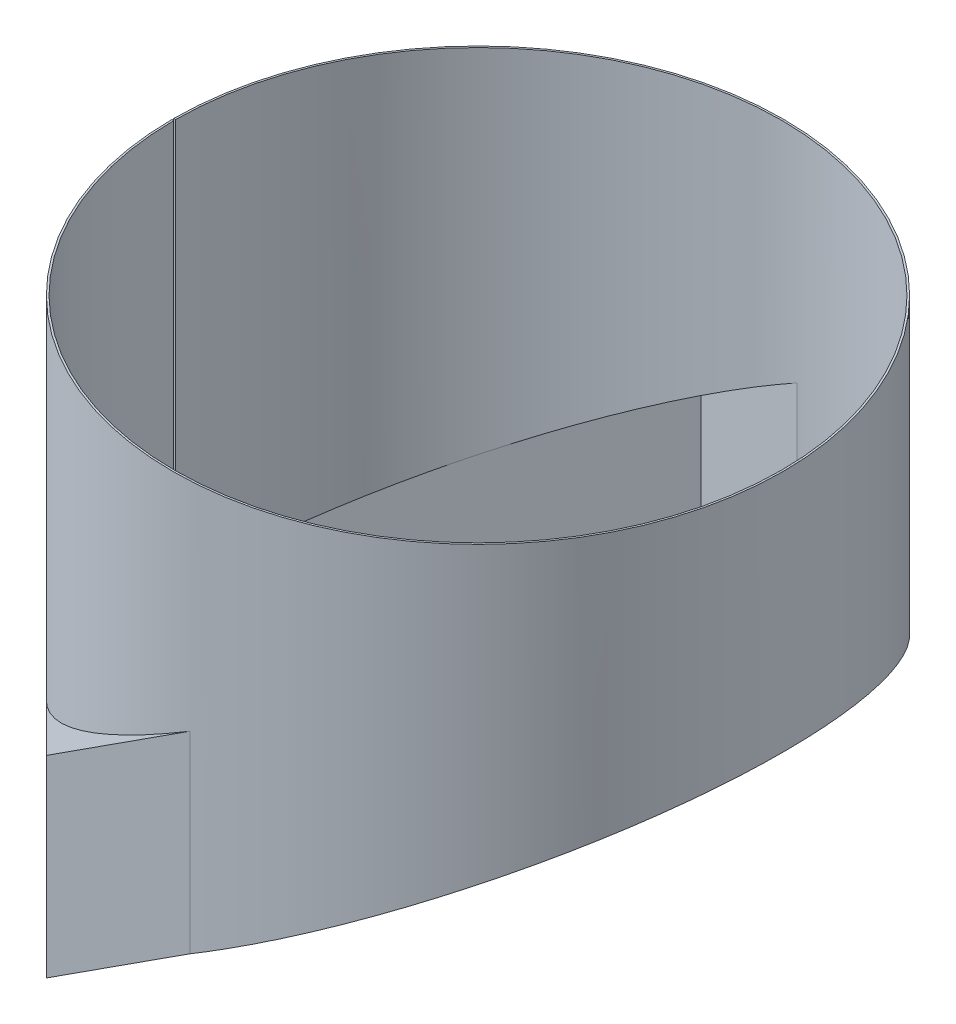
ISO-10303-21;
HEADER;
FILE_DESCRIPTION(('STEP AP214'),'2;1');
FILE_NAME('part.step','',(''),(''),'','','');
FILE_SCHEMA(('AUTOMOTIVE_DESIGN { 1 0 10303 214 1 1 1 1 }'));
ENDSEC;
DATA;
#1=APPLICATION_CONTEXT('core data for automotive mechanical design processes');
#2=APPLICATION_PROTOCOL_DEFINITION('international standard','automotive_design',2000,#1);
#3=PRODUCT_CONTEXT('',#1,'mechanical');
#4=PRODUCT('Part','Part','',(#3));
#5=PRODUCT_RELATED_PRODUCT_CATEGORY('part','',(#4));
#6=PRODUCT_DEFINITION_FORMATION('','',#4);
#7=PRODUCT_DEFINITION_CONTEXT('part definition',#1,'design');
#8=PRODUCT_DEFINITION('design','',#6,#7);
#9=PRODUCT_DEFINITION_SHAPE('','',#8);
#10=(LENGTH_UNIT() NAMED_UNIT(*) SI_UNIT(.MILLI.,.METRE.));
#11=(NAMED_UNIT(*) PLANE_ANGLE_UNIT() SI_UNIT($,.RADIAN.));
#12=(NAMED_UNIT(*) SI_UNIT($,.STERADIAN.) SOLID_ANGLE_UNIT());
#13=UNCERTAINTY_MEASURE_WITH_UNIT(LENGTH_MEASURE(1.E-05),#10,'distance_accuracy_value','');
#14=(GEOMETRIC_REPRESENTATION_CONTEXT(3) GLOBAL_UNCERTAINTY_ASSIGNED_CONTEXT((#13)) GLOBAL_UNIT_ASSIGNED_CONTEXT((#10,
#11,#12)) REPRESENTATION_CONTEXT('',''));
#15=CARTESIAN_POINT('',(0.,0.,0.));
#16=DIRECTION('',(0.,0.,1.));
#17=DIRECTION('',(1.,0.,0.));
#18=AXIS2_PLACEMENT_3D('',#15,#16,#17);
#19=CARTESIAN_POINT('',(230.261909045248,-363.20368421664,0.));
#20=DIRECTION('',(0.,1.,0.));
#21=DIRECTION('',(0.,0.,1.));
#22=AXIS2_PLACEMENT_3D('',#19,#20,#21);
#23=CYLINDRICAL_SURFACE('',#22,163.819757334855);
#24=CARTESIAN_POINT('',(230.261909045248,358.,0.));
#25=DIRECTION('',(0.,1.,0.));
#26=DIRECTION('',(0.,0.,1.));
#27=AXIS2_PLACEMENT_3D('',#24,#25,#26);
#28=CIRCLE('',#27,163.819757334855);
#29=CARTESIAN_POINT('',(66.4429147458969,358.,0.500000000000001));
#30=VERTEX_POINT('',#29);
#31=CARTESIAN_POINT('',(66.4429147458969,358.,-0.499999999999999));
#32=VERTEX_POINT('',#31);
#33=EDGE_CURVE('E199',#30,#32,#28,.T.);
#34=ORIENTED_EDGE('',*,*,#33,.F.);
#35=DIRECTION('',(0.,1.,0.));
#36=VECTOR('',#35,1.);
#37=CARTESIAN_POINT('',(66.4429147458969,-363.20368421664,0.500000000000001));
#38=LINE('',#37,#36);
#39=CARTESIAN_POINT('',(66.4429147458969,140.675901178656,0.500000000000001));
#40=VERTEX_POINT('',#39);
#41=EDGE_CURVE('E400',#30,#40,#38,.F.);
#42=ORIENTED_EDGE('',*,*,#41,.T.);
#43=CARTESIAN_POINT('',(230.261909045248,235.256841635759,0.));
#44=DIRECTION('',(0.499999999999995,-0.866025403784442,0.));
#45=DIRECTION('',(0.866025403784442,0.499999999999995,0.));
#46=AXIS2_PLACEMENT_3D('',#43,#44,#45);
#47=ELLIPSE('',#46,189.162761991714,163.819757334855);
#48=CARTESIAN_POINT('',(102.35129265954,161.407612833261,102.351292659541));
#49=VERTEX_POINT('',#48);
#50=EDGE_CURVE('E290',#40,#49,#47,.F.);
#51=ORIENTED_EDGE('',*,*,#50,.T.);
#52=CARTESIAN_POINT('',(114.423847741437,168.3777057596,115.83806130381));
#53=VERTEX_POINT('',#52);
#54=EDGE_CURVE('E250',#49,#53,#47,.F.);
#55=ORIENTED_EDGE('',*,*,#54,.T.);
#56=DIRECTION('',(0.,1.,0.));
#57=VECTOR('',#56,1.);
#58=CARTESIAN_POINT('',(114.423847741436,168.95505602879,115.83806130381));
#59=LINE('',#58,#57);
#60=CARTESIAN_POINT('',(114.423847741436,169.532406297979,115.83806130381));
#61=VERTEX_POINT('',#60);
#62=EDGE_CURVE('E268',#61,#53,#59,.F.);
#63=ORIENTED_EDGE('',*,*,#62,.F.);
#64=CARTESIAN_POINT('',(230.261909045248,236.411542174138,0.));
#65=DIRECTION('',(0.499999999999995,-0.866025403784442,0.));
#66=DIRECTION('',(0.866025403784442,0.499999999999995,0.));
#67=AXIS2_PLACEMENT_3D('',#64,#65,#66);
#68=ELLIPSE('',#67,189.162761991714,163.819757334855);
#69=CARTESIAN_POINT('',(239.145793207002,241.540655086377,163.578695114771));
#70=VERTEX_POINT('',#69);
#71=EDGE_CURVE('E225',#61,#70,#68,.F.);
#72=ORIENTED_EDGE('',*,*,#71,.T.);
#73=DIRECTION('',(0.,1.,0.));
#74=VECTOR('',#73,1.);
#75=CARTESIAN_POINT('',(239.145793207002,241.540655086377,163.578695114771));
#76=LINE('',#75,#74);
#77=CARTESIAN_POINT('',(239.145793207002,138.070888083627,163.578695114771));
#78=VERTEX_POINT('',#77);
#79=EDGE_CURVE('E237',#70,#78,#76,.F.);
#80=ORIENTED_EDGE('',*,*,#79,.T.);
#81=CARTESIAN_POINT('',(230.261909045248,132.941775171389,0.));
#82=DIRECTION('',(0.499999999999995,-0.866025403784442,0.));
#83=DIRECTION('',(0.866025403784442,0.499999999999995,0.));
#84=AXIS2_PLACEMENT_3D('',#81,#82,#83);
#85=ELLIPSE('',#84,189.162761991714,163.819757334855);
#86=CARTESIAN_POINT('',(239.145793207002,138.070888083627,-163.578695114771));
#87=VERTEX_POINT('',#86);
#88=EDGE_CURVE('E247',#78,#87,#85,.F.);
#89=ORIENTED_EDGE('',*,*,#88,.T.);
#90=DIRECTION('',(0.,1.,0.));
#91=VECTOR('',#90,1.);
#92=CARTESIAN_POINT('',(239.145793207002,241.540655086376,-163.578695114771));
#93=LINE('',#92,#91);
#94=CARTESIAN_POINT('',(239.145793207002,241.540655086376,-163.578695114771));
#95=VERTEX_POINT('',#94);
#96=EDGE_CURVE('E240',#95,#87,#93,.F.);
#97=ORIENTED_EDGE('',*,*,#96,.F.);
#98=CARTESIAN_POINT('',(230.261909045248,236.411542174138,0.));
#99=DIRECTION('',(0.499999999999995,-0.866025403784442,0.));
#100=DIRECTION('',(0.866025403784442,0.499999999999995,0.));
#101=AXIS2_PLACEMENT_3D('',#98,#99,#100);
#102=ELLIPSE('',#101,189.162761991714,163.819757334855);
#103=CARTESIAN_POINT('',(114.423847741437,169.532406297979,-115.83806130381));
#104=VERTEX_POINT('',#103);
#105=EDGE_CURVE('E244',#95,#104,#102,.F.);
#106=ORIENTED_EDGE('',*,*,#105,.T.);
#107=DIRECTION('',(0.,1.,0.));
#108=VECTOR('',#107,1.);
#109=CARTESIAN_POINT('',(114.423847741436,168.95505602879,-115.83806130381));
#110=LINE('',#109,#108);
#111=CARTESIAN_POINT('',(114.423847741436,168.3777057596,-115.83806130381));
#112=VERTEX_POINT('',#111);
#113=EDGE_CURVE('E271',#104,#112,#110,.F.);
#114=ORIENTED_EDGE('',*,*,#113,.T.);
#115=CARTESIAN_POINT('',(102.35129265954,161.407612833261,-102.351292659541));
#116=VERTEX_POINT('',#115);
#117=EDGE_CURVE('E248',#112,#116,#47,.F.);
#118=ORIENTED_EDGE('',*,*,#117,.T.);
#119=CARTESIAN_POINT('',(66.4429147458969,140.675901178656,-0.499999999999999));
#120=VERTEX_POINT('',#119);
#121=EDGE_CURVE('E289',#116,#120,#47,.F.);
#122=ORIENTED_EDGE('',*,*,#121,.T.);
#123=DIRECTION('',(0.,1.,0.));
#124=VECTOR('',#123,1.);
#125=CARTESIAN_POINT('',(66.4429147458969,-363.20368421664,-0.499999999999999));
#126=LINE('',#125,#124);
#127=EDGE_CURVE('E52',#120,#32,#126,.T.);
#128=ORIENTED_EDGE('',*,*,#127,.T.);
#129=EDGE_LOOP('',(#34,#42,#51,#55,#63,#72,#80,#89,#97,#106,#114,#118,#122,#128));
#130=FACE_BOUND('',#129,.T.);
#131=ADVANCED_FACE('F37',(#130),#23,.T.);
#132=CARTESIAN_POINT('',(230.261909045248,358.,0.));
#133=DIRECTION('',(0.,1.,0.));
#134=DIRECTION('',(0.,0.,1.));
#135=AXIS2_PLACEMENT_3D('',#132,#133,#134);
#136=PLANE('',#135);
#137=CARTESIAN_POINT('',(230.261909045248,358.,0.));
#138=DIRECTION('',(0.,1.,0.));
#139=DIRECTION('',(0.,0.,1.));
#140=AXIS2_PLACEMENT_3D('',#137,#138,#139);
#141=CIRCLE('',#140,162.819757334855);
#142=CARTESIAN_POINT('',(67.4429194323005,358.,0.500000000000001));
#143=VERTEX_POINT('',#142);
#144=CARTESIAN_POINT('',(67.4429194323005,358.,-0.499999999999999));
#145=VERTEX_POINT('',#144);
#146=EDGE_CURVE('E197',#143,#145,#141,.T.);
#147=ORIENTED_EDGE('',*,*,#146,.F.);
#148=DIRECTION('',(1.,0.,0.));
#149=VECTOR('',#148,1.);
#150=CARTESIAN_POINT('',(151.507940961405,358.,0.499999999999985));
#151=LINE('',#150,#149);
#152=EDGE_CURVE('E200',#30,#143,#151,.T.);
#153=ORIENTED_EDGE('',*,*,#152,.F.);
#154=ORIENTED_EDGE('',*,*,#33,.T.);
#155=DIRECTION('',(-1.,0.,0.));
#156=VECTOR('',#155,1.);
#157=CARTESIAN_POINT('',(151.507940961405,358.,-0.500000000000015));
#158=LINE('',#157,#156);
#159=EDGE_CURVE('E186',#145,#32,#158,.T.);
#160=ORIENTED_EDGE('',*,*,#159,.F.);
#161=EDGE_LOOP('',(#147,#153,#154,#160));
#162=FACE_BOUND('',#161,.T.);
#163=ADVANCED_FACE('F195',(#162),#136,.T.);
#164=CARTESIAN_POINT('',(230.261909045248,-363.20368421664,0.));
#165=DIRECTION('',(0.,1.,0.));
#166=DIRECTION('',(0.,0.,1.));
#167=AXIS2_PLACEMENT_3D('',#164,#165,#166);
#168=CYLINDRICAL_SURFACE('',#167,162.819757334855);
#169=DIRECTION('',(0.,1.,0.));
#170=VECTOR('',#169,1.);
#171=CARTESIAN_POINT('',(67.4429194323005,-363.20368421664,0.5));
#172=LINE('',#171,#170);
#173=CARTESIAN_POINT('',(67.4429194323004,141.253254153542,0.500000000000001));
#174=VERTEX_POINT('',#173);
#175=EDGE_CURVE('E60',#143,#174,#172,.F.);
#176=ORIENTED_EDGE('',*,*,#175,.F.);
#177=ORIENTED_EDGE('',*,*,#146,.T.);
#178=DIRECTION('',(0.,1.,0.));
#179=VECTOR('',#178,1.);
#180=CARTESIAN_POINT('',(67.4429194323005,-363.20368421664,-0.499999999999999));
#181=LINE('',#180,#179);
#182=CARTESIAN_POINT('',(67.4429194323004,141.253254153542,-0.499999999999999));
#183=VERTEX_POINT('',#182);
#184=EDGE_CURVE('E183',#183,#145,#181,.T.);
#185=ORIENTED_EDGE('',*,*,#184,.F.);
#186=CARTESIAN_POINT('',(230.261909045248,235.256841635759,0.));
#187=DIRECTION('',(0.499999999999995,-0.866025403784442,0.));
#188=DIRECTION('',(0.866025403784442,0.499999999999995,0.));
#189=AXIS2_PLACEMENT_3D('',#186,#187,#188);
#190=ELLIPSE('',#189,188.008061453335,162.819757334855);
#191=CARTESIAN_POINT('',(115.130954522623,168.785954050064,-115.130954522623));
#192=VERTEX_POINT('',#191);
#193=EDGE_CURVE('E326',#192,#183,#190,.F.);
#194=ORIENTED_EDGE('',*,*,#193,.F.);
#195=CARTESIAN_POINT('',(239.023011444508,240.31506646437,-162.583875163962));
#196=VERTEX_POINT('',#195);
#197=EDGE_CURVE('E221',#196,#192,#190,.F.);
#198=ORIENTED_EDGE('',*,*,#197,.F.);
#199=DIRECTION('',(0.,-1.,0.));
#200=VECTOR('',#199,1.);
#201=CARTESIAN_POINT('',(239.023011444508,240.31506646437,-162.583875163962));
#202=LINE('',#201,#200);
#203=CARTESIAN_POINT('',(239.023011444508,138.,-162.583875163962));
#204=VERTEX_POINT('',#203);
#205=EDGE_CURVE('E313',#196,#204,#202,.T.);
#206=ORIENTED_EDGE('',*,*,#205,.T.);
#207=CARTESIAN_POINT('',(230.261909045248,132.941775171389,0.));
#208=DIRECTION('',(0.499999999999995,-0.866025403784442,0.));
#209=DIRECTION('',(0.866025403784442,0.499999999999995,0.));
#210=AXIS2_PLACEMENT_3D('',#207,#208,#209);
#211=ELLIPSE('',#210,188.008061453335,162.819757334855);
#212=CARTESIAN_POINT('',(239.023011444508,138.,162.583875163961));
#213=VERTEX_POINT('',#212);
#214=EDGE_CURVE('E217',#213,#204,#211,.F.);
#215=ORIENTED_EDGE('',*,*,#214,.F.);
#216=DIRECTION('',(0.,-1.,0.));
#217=VECTOR('',#216,1.);
#218=CARTESIAN_POINT('',(239.023011444508,240.31506646437,162.583875163961));
#219=LINE('',#218,#217);
#220=CARTESIAN_POINT('',(239.023011444508,240.31506646437,162.583875163961));
#221=VERTEX_POINT('',#220);
#222=EDGE_CURVE('E318',#221,#213,#219,.T.);
#223=ORIENTED_EDGE('',*,*,#222,.F.);
#224=CARTESIAN_POINT('',(115.130954522623,168.785954050064,115.130954522623));
#225=VERTEX_POINT('',#224);
#226=EDGE_CURVE('E322',#225,#221,#190,.F.);
#227=ORIENTED_EDGE('',*,*,#226,.F.);
#228=EDGE_CURVE('E325',#174,#225,#190,.F.);
#229=ORIENTED_EDGE('',*,*,#228,.F.);
#230=EDGE_LOOP('',(#176,#177,#185,#194,#198,#206,#215,#223,#227,#229));
#231=FACE_BOUND('',#230,.T.);
#232=ADVANCED_FACE('F202',(#231),#168,.F.);
#233=CARTESIAN_POINT('',(0.,102.31506646437,0.));
#234=DIRECTION('',(0.499999999999995,-0.866025403784442,0.));
#235=DIRECTION('',(0.866025403784442,0.499999999999995,0.));
#236=AXIS2_PLACEMENT_3D('',#233,#234,#235);
#237=PLANE('',#236);
#238=ORIENTED_EDGE('',*,*,#50,.F.);
#239=DIRECTION('',(0.866025403784442,0.499999999999995,0.));
#240=VECTOR('',#239,1.);
#241=CARTESIAN_POINT('',(0.,102.31506646437,0.500000000000013));
#242=LINE('',#241,#240);
#243=EDGE_CURVE('E12',#40,#174,#242,.T.);
#244=ORIENTED_EDGE('',*,*,#243,.T.);
#245=ORIENTED_EDGE('',*,*,#228,.T.);
#246=DIRECTION('',(-0.654653670707976,-0.377964473009221,-0.654653670707982));
#247=VECTOR('',#246,1.);
#248=CARTESIAN_POINT('',(175.,203.351363572553,175.000000000002));
#249=LINE('',#248,#247);
#250=EDGE_CURVE('E302',#225,#49,#249,.T.);
#251=ORIENTED_EDGE('',*,*,#250,.T.);
#252=EDGE_LOOP('',(#238,#244,#245,#251));
#253=FACE_BOUND('',#252,.T.);
#254=ADVANCED_FACE('F412',(#253),#237,.T.);
#255=ORIENTED_EDGE('',*,*,#193,.T.);
#256=DIRECTION('',(-0.866025403784442,-0.499999999999995,0.));
#257=VECTOR('',#256,1.);
#258=CARTESIAN_POINT('',(0.,102.31506646437,-0.499999999999987));
#259=LINE('',#258,#257);
#260=EDGE_CURVE('E45',#183,#120,#259,.T.);
#261=ORIENTED_EDGE('',*,*,#260,.T.);
#262=ORIENTED_EDGE('',*,*,#121,.F.);
#263=DIRECTION('',(0.654653670707975,0.377964473009221,-0.654653670707982));
#264=VECTOR('',#263,1.);
#265=CARTESIAN_POINT('',(8.48528137423848,107.214045949936,-8.48528137423866));
#266=LINE('',#265,#264);
#267=EDGE_CURVE('E393',#116,#192,#266,.T.);
#268=ORIENTED_EDGE('',*,*,#267,.T.);
#269=EDGE_LOOP('',(#255,#261,#262,#268));
#270=FACE_BOUND('',#269,.T.);
#271=ADVANCED_FACE('F503',(#270),#237,.T.);
#272=CARTESIAN_POINT('',(0.,138.,0.));
#273=DIRECTION('',(0.,1.,0.));
#274=DIRECTION('',(0.,0.,1.));
#275=AXIS2_PLACEMENT_3D('',#272,#273,#274);
#276=PLANE('',#275);
#277=DIRECTION('',(0.707106781186544,0.,0.707106781186551));
#278=VECTOR('',#277,1.);
#279=CARTESIAN_POINT('',(175.,138.,175.000000000002));
#280=LINE('',#279,#278);
#281=CARTESIAN_POINT('',(8.48528137423851,138.,8.48528137423862));
#282=VERTEX_POINT('',#281);
#283=CARTESIAN_POINT('',(61.8081179484305,138.,61.8081179484311));
#284=VERTEX_POINT('',#283);
#285=EDGE_CURVE('E215',#282,#284,#280,.T.);
#286=ORIENTED_EDGE('',*,*,#285,.F.);
#287=CARTESIAN_POINT('',(0.,138.,0.));
#288=DIRECTION('',(0.,-1.,0.));
#289=DIRECTION('',(0.,0.,1.));
#290=AXIS2_PLACEMENT_3D('',#287,#288,#289);
#291=CIRCLE('',#290,12.);
#292=CARTESIAN_POINT('',(7.74866048145727,138.,9.16287404383047));
#293=VERTEX_POINT('',#292);
#294=EDGE_CURVE('E236',#282,#293,#291,.T.);
#295=ORIENTED_EDGE('',*,*,#294,.T.);
#296=DIRECTION('',(0.707106781186544,0.,0.707106781186551));
#297=VECTOR('',#296,1.);
#298=CARTESIAN_POINT('',(174.292893218813,138.,175.707106781188));
#299=LINE('',#298,#297);
#300=CARTESIAN_POINT('',(61.8081179484305,138.,63.2223315108043));
#301=VERTEX_POINT('',#300);
#302=EDGE_CURVE('E235',#293,#301,#299,.T.);
#303=ORIENTED_EDGE('',*,*,#302,.T.);
#304=DIRECTION('',(0.,0.,-1.));
#305=VECTOR('',#304,1.);
#306=CARTESIAN_POINT('',(61.8081179484305,138.,0.));
#307=LINE('',#306,#305);
#308=EDGE_CURVE('E222',#301,#284,#307,.T.);
#309=ORIENTED_EDGE('',*,*,#308,.T.);
#310=EDGE_LOOP('',(#286,#295,#303,#309));
#311=FACE_BOUND('',#310,.T.);
#312=ADVANCED_FACE('F350',(#311),#276,.T.);
#313=CARTESIAN_POINT('',(0.,138.,0.));
#314=DIRECTION('',(0.,-1.,0.));
#315=DIRECTION('',(0.,0.,-1.));
#316=AXIS2_PLACEMENT_3D('',#313,#314,#315);
#317=CYLINDRICAL_SURFACE('',#316,12.);
#318=DIRECTION('',(0.,-1.,0.));
#319=VECTOR('',#318,1.);
#320=CARTESIAN_POINT('',(8.48528137423848,138.,-8.48528137423866));
#321=LINE('',#320,#319);
#322=CARTESIAN_POINT('',(8.48528137423848,138.,-8.48528137423866));
#323=VERTEX_POINT('',#322);
#324=CARTESIAN_POINT('',(8.48528137423848,4.89897948556622,-8.48528137423866));
#325=VERTEX_POINT('',#324);
#326=EDGE_CURVE('E332',#323,#325,#321,.T.);
#327=ORIENTED_EDGE('',*,*,#326,.F.);
#328=CARTESIAN_POINT('',(7.74866048145724,138.,-9.1628740438305));
#329=VERTEX_POINT('',#328);
#330=EDGE_CURVE('E232',#329,#323,#291,.T.);
#331=ORIENTED_EDGE('',*,*,#330,.F.);
#332=DIRECTION('',(0.,-1.,0.));
#333=VECTOR('',#332,1.);
#334=CARTESIAN_POINT('',(7.74866048145724,138.,-9.1628740438305));
#335=LINE('',#334,#333);
#336=CARTESIAN_POINT('',(7.74866048145724,4.47369121482829,-9.1628740438305));
#337=VERTEX_POINT('',#336);
#338=EDGE_CURVE('E265',#329,#337,#335,.T.);
#339=ORIENTED_EDGE('',*,*,#338,.T.);
#340=CARTESIAN_POINT('',(0.,0.,0.));
#341=DIRECTION('',(0.499999999999995,-0.866025403784442,0.));
#342=DIRECTION('',(-0.866025403784442,-0.499999999999995,0.));
#343=AXIS2_PLACEMENT_3D('',#340,#341,#342);
#344=ELLIPSE('',#343,13.856406460551,12.);
#345=EDGE_CURVE('E231',#325,#337,#344,.F.);
#346=ORIENTED_EDGE('',*,*,#345,.F.);
#347=EDGE_LOOP('',(#327,#331,#339,#346));
#348=FACE_BOUND('',#347,.T.);
#349=ADVANCED_FACE('F583',(#348),#317,.F.);
#350=CARTESIAN_POINT('',(0.,102.31506646437,0.));
#351=DIRECTION('',(0.499999999999995,-0.866025403784442,0.));
#352=DIRECTION('',(0.866025403784442,0.499999999999995,0.));
#353=AXIS2_PLACEMENT_3D('',#350,#351,#352);
#354=PLANE('',#353);
#355=CARTESIAN_POINT('',(61.8081179484305,138.,-61.8081179484313));
#356=VERTEX_POINT('',#355);
#357=CARTESIAN_POINT('',(61.8081179484305,138.,-63.2223315108044));
#358=VERTEX_POINT('',#357);
#359=EDGE_CURVE('E226',#356,#358,#307,.T.);
#360=ORIENTED_EDGE('',*,*,#359,.F.);
#361=EDGE_CURVE('E390',#356,#116,#266,.T.);
#362=ORIENTED_EDGE('',*,*,#361,.T.);
#363=ORIENTED_EDGE('',*,*,#117,.F.);
#364=DIRECTION('',(0.654653670707975,0.377964473009221,-0.654653670707983));
#365=VECTOR('',#364,1.);
#366=CARTESIAN_POINT('',(15.4967379295343,111.262112279548,-16.9109514919077));
#367=LINE('',#366,#365);
#368=EDGE_CURVE('E208',#358,#112,#367,.T.);
#369=ORIENTED_EDGE('',*,*,#368,.F.);
#370=EDGE_LOOP('',(#360,#362,#363,#369));
#371=FACE_BOUND('',#370,.T.);
#372=ADVANCED_FACE('F389',(#371),#354,.F.);
#373=DIRECTION('',(-0.707106781186544,0.,0.707106781186552));
#374=VECTOR('',#373,1.);
#375=CARTESIAN_POINT('',(8.48528137423848,138.,-8.48528137423866));
#376=LINE('',#375,#374);
#377=EDGE_CURVE('E220',#356,#323,#376,.T.);
#378=ORIENTED_EDGE('',*,*,#377,.F.);
#379=ORIENTED_EDGE('',*,*,#359,.T.);
#380=DIRECTION('',(-0.707106781186544,0.,0.707106781186551));
#381=VECTOR('',#380,1.);
#382=CARTESIAN_POINT('',(7.77817459305193,138.,-9.1923881554252));
#383=LINE('',#382,#381);
#384=EDGE_CURVE('E277',#358,#329,#383,.T.);
#385=ORIENTED_EDGE('',*,*,#384,.T.);
#386=ORIENTED_EDGE('',*,*,#330,.T.);
#387=EDGE_LOOP('',(#378,#379,#385,#386));
#388=FACE_BOUND('',#387,.T.);
#389=ADVANCED_FACE('F422',(#388),#276,.T.);
#390=CARTESIAN_POINT('',(239.023011444508,138.,-162.583875163962));
#391=DIRECTION('',(0.499999999999995,-0.866025403784442,0.));
#392=DIRECTION('',(0.866025403784442,0.499999999999995,0.));
#393=AXIS2_PLACEMENT_3D('',#390,#391,#392);
#394=PLANE('',#393);
#395=DIRECTION('',(-0.654653670707976,-0.377964473009221,-0.654653670707982));
#396=VECTOR('',#395,1.);
#397=CARTESIAN_POINT('',(184.146144492072,106.316826092728,184.146144492074));
#398=LINE('',#397,#396);
#399=CARTESIAN_POINT('',(175.,101.036297108183,175.000000000002));
#400=VERTEX_POINT('',#399);
#401=CARTESIAN_POINT('',(8.48528137423851,4.89897948556625,8.48528137423861));
#402=VERTEX_POINT('',#401);
#403=EDGE_CURVE('E211',#400,#402,#398,.T.);
#404=ORIENTED_EDGE('',*,*,#403,.F.);
#405=DIRECTION('',(-0.854063760775078,-0.493093942188589,0.165630482422911));
#406=VECTOR('',#405,1.);
#407=CARTESIAN_POINT('',(288.134041567968,166.354266461959,153.059663992359));
#408=LINE('',#407,#406);
#409=EDGE_CURVE('E205',#213,#400,#408,.T.);
#410=ORIENTED_EDGE('',*,*,#409,.F.);
#411=ORIENTED_EDGE('',*,*,#214,.T.);
#412=DIRECTION('',(0.854063760775078,0.493093942188589,0.165630482422912));
#413=VECTOR('',#412,1.);
#414=CARTESIAN_POINT('',(190.566659732938,110.023712295378,-171.981123096783));
#415=LINE('',#414,#413);
#416=CARTESIAN_POINT('',(175.,101.036297108183,-175.000000000002));
#417=VERTEX_POINT('',#416);
#418=EDGE_CURVE('E336',#417,#204,#415,.T.);
#419=ORIENTED_EDGE('',*,*,#418,.F.);
#420=DIRECTION('',(0.654653670707975,0.377964473009221,-0.654653670707983));
#421=VECTOR('',#420,1.);
#422=CARTESIAN_POINT('',(41.4192428128474,23.9134109876276,-41.4192428128479));
#423=LINE('',#422,#421);
#424=EDGE_CURVE('E339',#325,#417,#423,.T.);
#425=ORIENTED_EDGE('',*,*,#424,.F.);
#426=ORIENTED_EDGE('',*,*,#345,.T.);
#427=DIRECTION('',(0.654653670707975,0.377964473009221,-0.654653670707983));
#428=VECTOR('',#427,1.);
#429=CARTESIAN_POINT('',(40.813151286116,23.5634838815157,-42.2273648484897));
#430=LINE('',#429,#428);
#431=CARTESIAN_POINT('',(174.668672756725,100.845005235088,-176.0828863191));
#432=VERTEX_POINT('',#431);
#433=EDGE_CURVE('E295',#337,#432,#430,.T.);
#434=ORIENTED_EDGE('',*,*,#433,.T.);
#435=DIRECTION('',(0.854063760775078,0.493093942188589,0.165630482422912));
#436=VECTOR('',#435,1.);
#437=CARTESIAN_POINT('',(190.71075428928,110.106905326271,-172.971809810136));
#438=LINE('',#437,#436);
#439=EDGE_CURVE('E264',#432,#87,#438,.T.);
#440=ORIENTED_EDGE('',*,*,#439,.T.);
#441=ORIENTED_EDGE('',*,*,#88,.F.);
#442=DIRECTION('',(-0.854063760775078,-0.493093942188589,0.165630482422911));
#443=VECTOR('',#442,1.);
#444=CARTESIAN_POINT('',(288.278136124311,166.437459492852,154.050350705711));
#445=LINE('',#444,#443);
#446=CARTESIAN_POINT('',(174.668672756725,100.845005235088,176.0828863191));
#447=VERTEX_POINT('',#446);
#448=EDGE_CURVE('E278',#78,#447,#445,.T.);
#449=ORIENTED_EDGE('',*,*,#448,.T.);
#450=DIRECTION('',(-0.654653670707976,-0.377964473009221,-0.654653670707982));
#451=VECTOR('',#450,1.);
#452=CARTESIAN_POINT('',(183.540052965341,105.966898986616,184.954266527716));
#453=LINE('',#452,#451);
#454=CARTESIAN_POINT('',(7.74866048145727,4.47369121482831,9.16287404383048));
#455=VERTEX_POINT('',#454);
#456=EDGE_CURVE('E230',#447,#455,#453,.T.);
#457=ORIENTED_EDGE('',*,*,#456,.T.);
#458=EDGE_CURVE('E227',#455,#402,#344,.F.);
#459=ORIENTED_EDGE('',*,*,#458,.T.);
#460=EDGE_LOOP('',(#404,#410,#411,#419,#425,#426,#434,#440,#441,#449,#457,#459));
#461=FACE_BOUND('',#460,.T.);
#462=ADVANCED_FACE('F420',(#461),#394,.T.);
#463=CARTESIAN_POINT('',(174.292893218813,138.,175.707106781188));
#464=DIRECTION('',(0.707106781186551,0.,-0.707106781186544));
#465=DIRECTION('',(-0.707106781186544,0.,-0.707106781186551));
#466=AXIS2_PLACEMENT_3D('',#463,#464,#465);
#467=PLANE('',#466);
#468=DIRECTION('',(-0.654653670707976,-0.377964473009221,-0.654653670707982));
#469=VECTOR('',#468,1.);
#470=CARTESIAN_POINT('',(157.937925323045,194.655270703259,159.35213888542));
#471=LINE('',#470,#469);
#472=CARTESIAN_POINT('',(174.668672756725,204.314772237838,176.0828863191));
#473=VERTEX_POINT('',#472);
#474=EDGE_CURVE('E243',#473,#61,#471,.T.);
#475=ORIENTED_EDGE('',*,*,#474,.T.);
#476=ORIENTED_EDGE('',*,*,#62,.T.);
#477=DIRECTION('',(-0.654653670707976,-0.377964473009221,-0.654653670707982));
#478=VECTOR('',#477,1.);
#479=CARTESIAN_POINT('',(158.223639608759,193.665527384648,159.637853171134));
#480=LINE('',#479,#478);
#481=EDGE_CURVE('E253',#53,#301,#480,.T.);
#482=ORIENTED_EDGE('',*,*,#481,.T.);
#483=ORIENTED_EDGE('',*,*,#302,.F.);
#484=DIRECTION('',(0.,-1.,0.));
#485=VECTOR('',#484,1.);
#486=CARTESIAN_POINT('',(7.74866048145727,138.,9.16287404383047));
#487=LINE('',#486,#485);
#488=EDGE_CURVE('E256',#293,#455,#487,.T.);
#489=ORIENTED_EDGE('',*,*,#488,.T.);
#490=ORIENTED_EDGE('',*,*,#456,.F.);
#491=DIRECTION('',(0.,-1.,0.));
#492=VECTOR('',#491,1.);
#493=CARTESIAN_POINT('',(174.668672756725,138.,176.0828863191));
#494=LINE('',#493,#492);
#495=EDGE_CURVE('E254',#473,#447,#494,.T.);
#496=ORIENTED_EDGE('',*,*,#495,.F.);
#497=EDGE_LOOP('',(#475,#476,#482,#483,#489,#490,#496));
#498=FACE_BOUND('',#497,.T.);
#499=ADVANCED_FACE('F358',(#498),#467,.F.);
#500=ORIENTED_EDGE('',*,*,#294,.F.);
#501=DIRECTION('',(0.,-1.,0.));
#502=VECTOR('',#501,1.);
#503=CARTESIAN_POINT('',(8.48528137423851,138.,8.48528137423862));
#504=LINE('',#503,#502);
#505=EDGE_CURVE('E329',#282,#402,#504,.T.);
#506=ORIENTED_EDGE('',*,*,#505,.T.);
#507=ORIENTED_EDGE('',*,*,#458,.F.);
#508=ORIENTED_EDGE('',*,*,#488,.F.);
#509=EDGE_LOOP('',(#500,#506,#507,#508));
#510=FACE_BOUND('',#509,.T.);
#511=ADVANCED_FACE('F353',(#510),#317,.F.);
#512=CARTESIAN_POINT('',(7.77817459305193,138.,-9.1923881554252));
#513=DIRECTION('',(0.707106781186551,0.,0.707106781186544));
#514=DIRECTION('',(0.707106781186544,0.,-0.707106781186551));
#515=AXIS2_PLACEMENT_3D('',#512,#513,#514);
#516=PLANE('',#515);
#517=ORIENTED_EDGE('',*,*,#433,.F.);
#518=ORIENTED_EDGE('',*,*,#338,.F.);
#519=ORIENTED_EDGE('',*,*,#384,.F.);
#520=ORIENTED_EDGE('',*,*,#368,.T.);
#521=ORIENTED_EDGE('',*,*,#113,.F.);
#522=DIRECTION('',(0.654653670707975,0.377964473009221,-0.654653670707983));
#523=VECTOR('',#522,1.);
#524=CARTESIAN_POINT('',(15.2110236438201,112.251855598158,-16.6252372061934));
#525=LINE('',#524,#523);
#526=CARTESIAN_POINT('',(174.668672756725,204.314772237837,-176.0828863191));
#527=VERTEX_POINT('',#526);
#528=EDGE_CURVE('E204',#104,#527,#525,.T.);
#529=ORIENTED_EDGE('',*,*,#528,.T.);
#530=DIRECTION('',(0.,-1.,0.));
#531=VECTOR('',#530,1.);
#532=CARTESIAN_POINT('',(174.668672756725,138.,-176.0828863191));
#533=LINE('',#532,#531);
#534=EDGE_CURVE('E261',#527,#432,#533,.T.);
#535=ORIENTED_EDGE('',*,*,#534,.T.);
#536=EDGE_LOOP('',(#517,#518,#519,#520,#521,#529,#535));
#537=FACE_BOUND('',#536,.T.);
#538=ADVANCED_FACE('F382',(#537),#516,.F.);
#539=CARTESIAN_POINT('',(175.190385101311,138.,-175.981709485134));
#540=DIRECTION('',(-0.190385101311452,0.,0.98170948513225));
#541=DIRECTION('',(0.981709485132251,0.,0.190385101311452));
#542=AXIS2_PLACEMENT_3D('',#539,#540,#541);
#543=PLANE('',#542);
#544=ORIENTED_EDGE('',*,*,#439,.F.);
#545=ORIENTED_EDGE('',*,*,#534,.F.);
#546=DIRECTION('',(0.854063760775078,0.493093942188589,0.165630482422912));
#547=VECTOR('',#546,1.);
#548=CARTESIAN_POINT('',(147.136151920784,188.418863921738,-181.422329248088));
#549=LINE('',#548,#547);
#550=EDGE_CURVE('E259',#527,#95,#549,.T.);
#551=ORIENTED_EDGE('',*,*,#550,.T.);
#552=ORIENTED_EDGE('',*,*,#96,.T.);
#553=EDGE_LOOP('',(#544,#545,#551,#552));
#554=FACE_BOUND('',#553,.T.);
#555=ADVANCED_FACE('F375',(#554),#543,.F.);
#556=CARTESIAN_POINT('',(304.101402608709,138.,150.981709485132));
#557=DIRECTION('',(-0.190385101311451,0.,-0.981709485132251));
#558=DIRECTION('',(-0.981709485132251,0.,0.190385101311451));
#559=AXIS2_PLACEMENT_3D('',#556,#557,#558);
#560=PLANE('',#559);
#561=ORIENTED_EDGE('',*,*,#448,.F.);
#562=ORIENTED_EDGE('',*,*,#79,.F.);
#563=DIRECTION('',(-0.854063760775079,-0.493093942188589,0.165630482422911));
#564=VECTOR('',#563,1.);
#565=CARTESIAN_POINT('',(244.703533755815,244.74941808832,162.500870143664));
#566=LINE('',#565,#564);
#567=EDGE_CURVE('E257',#70,#473,#566,.T.);
#568=ORIENTED_EDGE('',*,*,#567,.T.);
#569=ORIENTED_EDGE('',*,*,#495,.T.);
#570=EDGE_LOOP('',(#561,#562,#568,#569));
#571=FACE_BOUND('',#570,.T.);
#572=ADVANCED_FACE('F370',(#571),#560,.F.);
#573=CARTESIAN_POINT('',(-0.499999999999995,103.181091868154,0.));
#574=DIRECTION('',(0.499999999999995,-0.866025403784442,0.));
#575=DIRECTION('',(0.866025403784442,0.499999999999995,0.));
#576=AXIS2_PLACEMENT_3D('',#573,#574,#575);
#577=PLANE('',#576);
#578=ORIENTED_EDGE('',*,*,#105,.F.);
#579=ORIENTED_EDGE('',*,*,#550,.F.);
#580=ORIENTED_EDGE('',*,*,#528,.F.);
#581=EDGE_LOOP('',(#578,#579,#580));
#582=FACE_BOUND('',#581,.T.);
#583=ADVANCED_FACE('F39',(#582),#577,.F.);
#584=ORIENTED_EDGE('',*,*,#54,.F.);
#585=EDGE_CURVE('E274',#49,#284,#249,.T.);
#586=ORIENTED_EDGE('',*,*,#585,.T.);
#587=ORIENTED_EDGE('',*,*,#308,.F.);
#588=ORIENTED_EDGE('',*,*,#481,.F.);
#589=EDGE_LOOP('',(#584,#586,#587,#588));
#590=FACE_BOUND('',#589,.T.);
#591=ADVANCED_FACE('F360',(#590),#354,.F.);
#592=ORIENTED_EDGE('',*,*,#71,.F.);
#593=ORIENTED_EDGE('',*,*,#474,.F.);
#594=ORIENTED_EDGE('',*,*,#567,.F.);
#595=EDGE_LOOP('',(#592,#593,#594));
#596=FACE_BOUND('',#595,.T.);
#597=ADVANCED_FACE('F367',(#596),#577,.F.);
#598=CARTESIAN_POINT('',(175.,138.,175.000000000002));
#599=DIRECTION('',(0.707106781186551,0.,-0.707106781186544));
#600=DIRECTION('',(-0.707106781186544,0.,-0.707106781186551));
#601=AXIS2_PLACEMENT_3D('',#598,#599,#600);
#602=PLANE('',#601);
#603=CARTESIAN_POINT('',(175.,203.351363572553,175.000000000002));
#604=VERTEX_POINT('',#603);
#605=EDGE_CURVE('E303',#604,#225,#249,.T.);
#606=ORIENTED_EDGE('',*,*,#605,.F.);
#607=DIRECTION('',(0.,-1.,0.));
#608=VECTOR('',#607,1.);
#609=CARTESIAN_POINT('',(175.,138.,175.000000000002));
#610=LINE('',#609,#608);
#611=EDGE_CURVE('E327',#604,#400,#610,.T.);
#612=ORIENTED_EDGE('',*,*,#611,.T.);
#613=ORIENTED_EDGE('',*,*,#403,.T.);
#614=ORIENTED_EDGE('',*,*,#505,.F.);
#615=ORIENTED_EDGE('',*,*,#285,.T.);
#616=ORIENTED_EDGE('',*,*,#585,.F.);
#617=ORIENTED_EDGE('',*,*,#250,.F.);
#618=EDGE_LOOP('',(#606,#612,#613,#614,#615,#616,#617));
#619=FACE_BOUND('',#618,.T.);
#620=ADVANCED_FACE('F346',(#619),#602,.T.);
#621=CARTESIAN_POINT('',(8.48528137423848,138.,-8.48528137423866));
#622=DIRECTION('',(0.707106781186551,0.,0.707106781186544));
#623=DIRECTION('',(0.707106781186544,0.,-0.707106781186551));
#624=AXIS2_PLACEMENT_3D('',#621,#622,#623);
#625=PLANE('',#624);
#626=ORIENTED_EDGE('',*,*,#424,.T.);
#627=DIRECTION('',(0.,-1.,0.));
#628=VECTOR('',#627,1.);
#629=CARTESIAN_POINT('',(175.,138.,-175.000000000002));
#630=LINE('',#629,#628);
#631=CARTESIAN_POINT('',(175.,203.351363572553,-175.000000000002));
#632=VERTEX_POINT('',#631);
#633=EDGE_CURVE('E334',#632,#417,#630,.T.);
#634=ORIENTED_EDGE('',*,*,#633,.F.);
#635=EDGE_CURVE('E395',#192,#632,#266,.T.);
#636=ORIENTED_EDGE('',*,*,#635,.F.);
#637=ORIENTED_EDGE('',*,*,#267,.F.);
#638=ORIENTED_EDGE('',*,*,#361,.F.);
#639=ORIENTED_EDGE('',*,*,#377,.T.);
#640=ORIENTED_EDGE('',*,*,#326,.T.);
#641=EDGE_LOOP('',(#626,#634,#636,#637,#638,#639,#640));
#642=FACE_BOUND('',#641,.T.);
#643=ADVANCED_FACE('F473',(#642),#625,.T.);
#644=CARTESIAN_POINT('',(175.,138.,-175.000000000002));
#645=DIRECTION('',(-0.190385101311452,0.,0.98170948513225));
#646=DIRECTION('',(0.981709485132251,0.,0.190385101311452));
#647=AXIS2_PLACEMENT_3D('',#644,#645,#646);
#648=PLANE('',#647);
#649=ORIENTED_EDGE('',*,*,#418,.T.);
#650=ORIENTED_EDGE('',*,*,#205,.F.);
#651=DIRECTION('',(0.854063760775078,0.493093942188589,0.165630482422912));
#652=VECTOR('',#651,1.);
#653=CARTESIAN_POINT('',(175.,203.351363572553,-175.000000000002));
#654=LINE('',#653,#652);
#655=EDGE_CURVE('E392',#632,#196,#654,.T.);
#656=ORIENTED_EDGE('',*,*,#655,.F.);
#657=ORIENTED_EDGE('',*,*,#633,.T.);
#658=EDGE_LOOP('',(#649,#650,#656,#657));
#659=FACE_BOUND('',#658,.T.);
#660=ADVANCED_FACE('F480',(#659),#648,.T.);
#661=CARTESIAN_POINT('',(303.911017507397,138.,150.));
#662=DIRECTION('',(-0.190385101311451,0.,-0.981709485132251));
#663=DIRECTION('',(-0.981709485132251,0.,0.190385101311451));
#664=AXIS2_PLACEMENT_3D('',#661,#662,#663);
#665=PLANE('',#664);
#666=ORIENTED_EDGE('',*,*,#409,.T.);
#667=ORIENTED_EDGE('',*,*,#611,.F.);
#668=DIRECTION('',(-0.854063760775078,-0.493093942188589,0.165630482422911));
#669=VECTOR('',#668,1.);
#670=CARTESIAN_POINT('',(239.023011444508,240.31506646437,162.583875163961));
#671=LINE('',#670,#669);
#672=EDGE_CURVE('E311',#221,#604,#671,.T.);
#673=ORIENTED_EDGE('',*,*,#672,.F.);
#674=ORIENTED_EDGE('',*,*,#222,.T.);
#675=EDGE_LOOP('',(#666,#667,#673,#674));
#676=FACE_BOUND('',#675,.T.);
#677=ADVANCED_FACE('F418',(#676),#665,.T.);
#678=ORIENTED_EDGE('',*,*,#197,.T.);
#679=ORIENTED_EDGE('',*,*,#635,.T.);
#680=ORIENTED_EDGE('',*,*,#655,.T.);
#681=EDGE_LOOP('',(#678,#679,#680));
#682=FACE_BOUND('',#681,.T.);
#683=ADVANCED_FACE('F494',(#682),#237,.T.);
#684=ORIENTED_EDGE('',*,*,#226,.T.);
#685=ORIENTED_EDGE('',*,*,#672,.T.);
#686=ORIENTED_EDGE('',*,*,#605,.T.);
#687=EDGE_LOOP('',(#684,#685,#686));
#688=FACE_BOUND('',#687,.T.);
#689=ADVANCED_FACE('F501',(#688),#237,.T.);
#690=CARTESIAN_POINT('',(151.507940961405,358.,-0.500000000000015));
#691=DIRECTION('',(0.,0.,1.));
#692=DIRECTION('',(1.,0.,0.));
#693=AXIS2_PLACEMENT_3D('',#690,#691,#692);
#694=PLANE('',#693);
#695=ORIENTED_EDGE('',*,*,#260,.F.);
#696=ORIENTED_EDGE('',*,*,#184,.T.);
#697=ORIENTED_EDGE('',*,*,#159,.T.);
#698=ORIENTED_EDGE('',*,*,#127,.F.);
#699=EDGE_LOOP('',(#695,#696,#697,#698));
#700=FACE_BOUND('',#699,.T.);
#701=ADVANCED_FACE('F185',(#700),#694,.T.);
#702=CARTESIAN_POINT('',(151.507940961405,358.,0.499999999999985));
#703=DIRECTION('',(0.,0.,-1.));
#704=DIRECTION('',(-1.,0.,0.));
#705=AXIS2_PLACEMENT_3D('',#702,#703,#704);
#706=PLANE('',#705);
#707=ORIENTED_EDGE('',*,*,#152,.T.);
#708=ORIENTED_EDGE('',*,*,#175,.T.);
#709=ORIENTED_EDGE('',*,*,#243,.F.);
#710=ORIENTED_EDGE('',*,*,#41,.F.);
#711=EDGE_LOOP('',(#707,#708,#709,#710));
#712=FACE_BOUND('',#711,.T.);
#713=ADVANCED_FACE('F410',(#712),#706,.T.);
#714=CLOSED_SHELL('',(#131,#163,#232,#254,#271,#312,#349,#372,#389,#462,#499,#511,#538,#555,
#572,#583,#591,#597,#620,#643,#660,#677,#683,#689,#701,#713));
#715=MANIFOLD_SOLID_BREP('B2',#714);
#716=ADVANCED_BREP_SHAPE_REPRESENTATION('',(#18,#715),#14);
#717=SHAPE_DEFINITION_REPRESENTATION(#9,#716);
ENDSEC;
END-ISO-10303-21;
